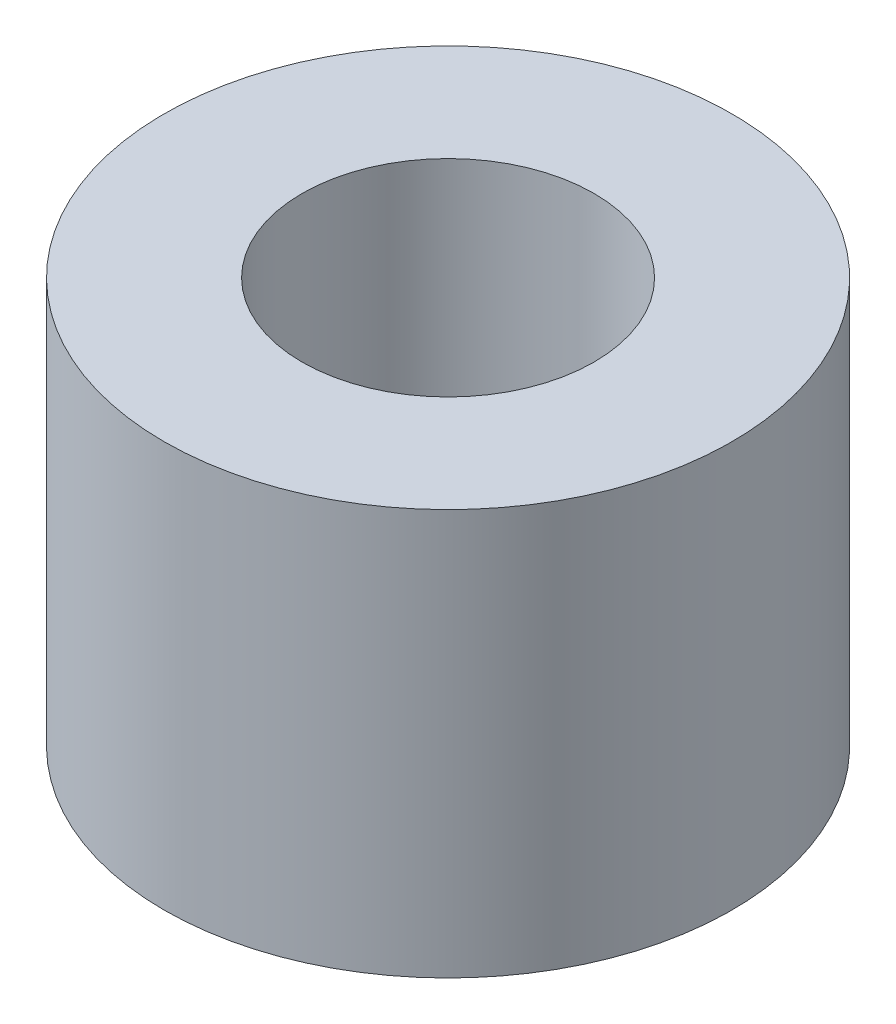
ISO-10303-21;
HEADER;
FILE_DESCRIPTION(('STEP AP214'),'2;1');
FILE_NAME('part.step','',(''),(''),'','','');
FILE_SCHEMA(('AUTOMOTIVE_DESIGN { 1 0 10303 214 1 1 1 1 }'));
ENDSEC;
DATA;
#1=APPLICATION_CONTEXT('core data for automotive mechanical design processes');
#2=APPLICATION_PROTOCOL_DEFINITION('international standard','automotive_design',2000,#1);
#3=PRODUCT_CONTEXT('',#1,'mechanical');
#4=PRODUCT('Part','Part','',(#3));
#5=PRODUCT_RELATED_PRODUCT_CATEGORY('part','',(#4));
#6=PRODUCT_DEFINITION_FORMATION('','',#4);
#7=PRODUCT_DEFINITION_CONTEXT('part definition',#1,'design');
#8=PRODUCT_DEFINITION('design','',#6,#7);
#9=PRODUCT_DEFINITION_SHAPE('','',#8);
#10=(LENGTH_UNIT() NAMED_UNIT(*) SI_UNIT(.MILLI.,.METRE.));
#11=(NAMED_UNIT(*) PLANE_ANGLE_UNIT() SI_UNIT($,.RADIAN.));
#12=(NAMED_UNIT(*) SI_UNIT($,.STERADIAN.) SOLID_ANGLE_UNIT());
#13=UNCERTAINTY_MEASURE_WITH_UNIT(LENGTH_MEASURE(1.E-05),#10,'distance_accuracy_value','');
#14=(GEOMETRIC_REPRESENTATION_CONTEXT(3) GLOBAL_UNCERTAINTY_ASSIGNED_CONTEXT((#13)) GLOBAL_UNIT_ASSIGNED_CONTEXT((#10,
#11,#12)) REPRESENTATION_CONTEXT('',''));
#15=CARTESIAN_POINT('',(0.,0.,0.));
#16=DIRECTION('',(0.,0.,1.));
#17=DIRECTION('',(1.,0.,0.));
#18=AXIS2_PLACEMENT_3D('',#15,#16,#17);
#19=CARTESIAN_POINT('',(0.,5.,0.));
#20=DIRECTION('',(0.,1.,0.));
#21=DIRECTION('',(0.,0.,1.));
#22=AXIS2_PLACEMENT_3D('',#19,#20,#21);
#23=PLANE('',#22);
#24=CARTESIAN_POINT('',(0.,5.,0.));
#25=DIRECTION('',(0.,1.,0.));
#26=DIRECTION('',(0.,0.,1.));
#27=AXIS2_PLACEMENT_3D('',#24,#25,#26);
#28=CIRCLE('',#27,3.5);
#29=CARTESIAN_POINT('',(0.,5.,3.5));
#30=VERTEX_POINT('',#29);
#31=EDGE_CURVE('E10',#30,#30,#28,.T.);
#32=ORIENTED_EDGE('',*,*,#31,.T.);
#33=EDGE_LOOP('',(#32));
#34=FACE_BOUND('',#33,.T.);
#35=CARTESIAN_POINT('',(0.,5.,0.));
#36=DIRECTION('',(0.,1.,0.));
#37=DIRECTION('',(0.,0.,1.));
#38=AXIS2_PLACEMENT_3D('',#35,#36,#37);
#39=CIRCLE('',#38,1.8);
#40=CARTESIAN_POINT('',(0.,5.,1.8));
#41=VERTEX_POINT('',#40);
#42=EDGE_CURVE('E42',#41,#41,#39,.T.);
#43=ORIENTED_EDGE('',*,*,#42,.F.);
#44=EDGE_LOOP('',(#43));
#45=FACE_BOUND('',#44,.T.);
#46=ADVANCED_FACE('F31',(#34,#45),#23,.T.);
#47=CARTESIAN_POINT('',(0.,0.,0.));
#48=DIRECTION('',(0.,1.,0.));
#49=DIRECTION('',(0.,0.,1.));
#50=AXIS2_PLACEMENT_3D('',#47,#48,#49);
#51=PLANE('',#50);
#52=CARTESIAN_POINT('',(0.,0.,0.));
#53=DIRECTION('',(0.,1.,0.));
#54=DIRECTION('',(0.,0.,1.));
#55=AXIS2_PLACEMENT_3D('',#52,#53,#54);
#56=CIRCLE('',#55,3.5);
#57=CARTESIAN_POINT('',(0.,0.,3.5));
#58=VERTEX_POINT('',#57);
#59=EDGE_CURVE('E35',#58,#58,#56,.T.);
#60=ORIENTED_EDGE('',*,*,#59,.F.);
#61=EDGE_LOOP('',(#60));
#62=FACE_BOUND('',#61,.T.);
#63=CARTESIAN_POINT('',(0.,0.,0.));
#64=DIRECTION('',(0.,1.,0.));
#65=DIRECTION('',(0.,0.,1.));
#66=AXIS2_PLACEMENT_3D('',#63,#64,#65);
#67=CIRCLE('',#66,1.8);
#68=CARTESIAN_POINT('',(0.,0.,1.8));
#69=VERTEX_POINT('',#68);
#70=EDGE_CURVE('E44',#69,#69,#67,.T.);
#71=ORIENTED_EDGE('',*,*,#70,.T.);
#72=EDGE_LOOP('',(#71));
#73=FACE_BOUND('',#72,.T.);
#74=ADVANCED_FACE('F54',(#62,#73),#51,.F.);
#75=CARTESIAN_POINT('',(0.,5.,0.));
#76=DIRECTION('',(0.,-1.,0.));
#77=DIRECTION('',(0.,0.,-1.));
#78=AXIS2_PLACEMENT_3D('',#75,#76,#77);
#79=CYLINDRICAL_SURFACE('',#78,3.5);
#80=ORIENTED_EDGE('',*,*,#31,.F.);
#81=EDGE_LOOP('',(#80));
#82=FACE_BOUND('',#81,.T.);
#83=ORIENTED_EDGE('',*,*,#59,.T.);
#84=EDGE_LOOP('',(#83));
#85=FACE_BOUND('',#84,.T.);
#86=ADVANCED_FACE('F33',(#82,#85),#79,.T.);
#87=CARTESIAN_POINT('',(0.,5.,0.));
#88=DIRECTION('',(0.,-1.,0.));
#89=DIRECTION('',(0.,0.,-1.));
#90=AXIS2_PLACEMENT_3D('',#87,#88,#89);
#91=CYLINDRICAL_SURFACE('',#90,1.8);
#92=ORIENTED_EDGE('',*,*,#42,.T.);
#93=EDGE_LOOP('',(#92));
#94=FACE_BOUND('',#93,.T.);
#95=ORIENTED_EDGE('',*,*,#70,.F.);
#96=EDGE_LOOP('',(#95));
#97=FACE_BOUND('',#96,.T.);
#98=ADVANCED_FACE('F50',(#94,#97),#91,.F.);
#99=CLOSED_SHELL('',(#46,#74,#86,#98));
#100=MANIFOLD_SOLID_BREP('B2',#99);
#101=ADVANCED_BREP_SHAPE_REPRESENTATION('',(#18,#100),#14);
#102=SHAPE_DEFINITION_REPRESENTATION(#9,#101);
ENDSEC;
END-ISO-10303-21;
